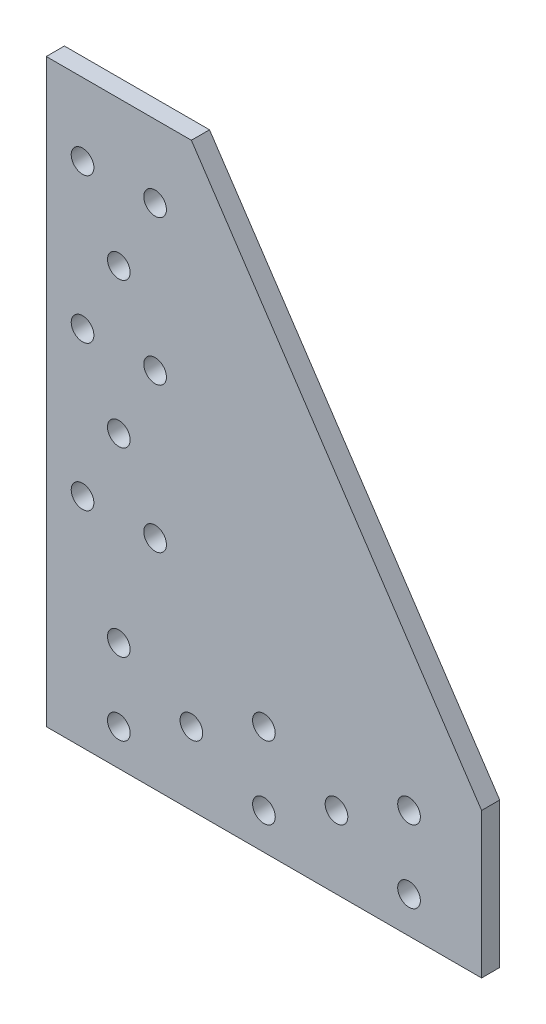
ISO-10303-21;
HEADER;
FILE_DESCRIPTION(('STEP AP214'),'2;1');
FILE_NAME('part.step','',(''),(''),'','','');
FILE_SCHEMA(('AUTOMOTIVE_DESIGN { 1 0 10303 214 1 1 1 1 }'));
ENDSEC;
DATA;
#1=APPLICATION_CONTEXT('core data for automotive mechanical design processes');
#2=APPLICATION_PROTOCOL_DEFINITION('international standard','automotive_design',2000,#1);
#3=PRODUCT_CONTEXT('',#1,'mechanical');
#4=PRODUCT('Part','Part','',(#3));
#5=PRODUCT_RELATED_PRODUCT_CATEGORY('part','',(#4));
#6=PRODUCT_DEFINITION_FORMATION('','',#4);
#7=PRODUCT_DEFINITION_CONTEXT('part definition',#1,'design');
#8=PRODUCT_DEFINITION('design','',#6,#7);
#9=PRODUCT_DEFINITION_SHAPE('','',#8);
#10=(LENGTH_UNIT() NAMED_UNIT(*) SI_UNIT(.MILLI.,.METRE.));
#11=(NAMED_UNIT(*) PLANE_ANGLE_UNIT() SI_UNIT($,.RADIAN.));
#12=(NAMED_UNIT(*) SI_UNIT($,.STERADIAN.) SOLID_ANGLE_UNIT());
#13=UNCERTAINTY_MEASURE_WITH_UNIT(LENGTH_MEASURE(1.E-05),#10,'distance_accuracy_value','');
#14=(GEOMETRIC_REPRESENTATION_CONTEXT(3) GLOBAL_UNCERTAINTY_ASSIGNED_CONTEXT((#13)) GLOBAL_UNIT_ASSIGNED_CONTEXT((#10,
#11,#12)) REPRESENTATION_CONTEXT('',''));
#15=CARTESIAN_POINT('',(0.,0.,0.));
#16=DIRECTION('',(0.,0.,1.));
#17=DIRECTION('',(1.,0.,0.));
#18=AXIS2_PLACEMENT_3D('',#15,#16,#17);
#19=CARTESIAN_POINT('',(-12.6999999999999,-584.2,3.175));
#20=DIRECTION('',(0.,1.,0.));
#21=DIRECTION('',(0.,0.,1.));
#22=AXIS2_PLACEMENT_3D('',#19,#20,#21);
#23=PLANE('',#22);
#24=DIRECTION('',(1.,0.,0.));
#25=VECTOR('',#24,1.);
#26=CARTESIAN_POINT('',(-12.6999999999999,-584.2,0.));
#27=LINE('',#26,#25);
#28=CARTESIAN_POINT('',(-12.6999999999999,-584.2,0.));
#29=VERTEX_POINT('',#28);
#30=CARTESIAN_POINT('',(63.5000000000001,-584.2,0.));
#31=VERTEX_POINT('',#30);
#32=EDGE_CURVE('E109',#29,#31,#27,.T.);
#33=ORIENTED_EDGE('',*,*,#32,.T.);
#34=DIRECTION('',(0.,0.,-1.));
#35=VECTOR('',#34,1.);
#36=CARTESIAN_POINT('',(63.5000000000001,-584.2,3.175));
#37=LINE('',#36,#35);
#38=CARTESIAN_POINT('',(63.5000000000001,-584.2,3.175));
#39=VERTEX_POINT('',#38);
#40=EDGE_CURVE('E11',#39,#31,#37,.T.);
#41=ORIENTED_EDGE('',*,*,#40,.F.);
#42=DIRECTION('',(1.,0.,0.));
#43=VECTOR('',#42,1.);
#44=CARTESIAN_POINT('',(-12.6999999999999,-584.2,3.175));
#45=LINE('',#44,#43);
#46=CARTESIAN_POINT('',(-12.6999999999999,-584.2,3.175));
#47=VERTEX_POINT('',#46);
#48=EDGE_CURVE('E118',#47,#39,#45,.T.);
#49=ORIENTED_EDGE('',*,*,#48,.F.);
#50=DIRECTION('',(0.,0.,-1.));
#51=VECTOR('',#50,1.);
#52=CARTESIAN_POINT('',(-12.6999999999999,-584.2,3.175));
#53=LINE('',#52,#51);
#54=EDGE_CURVE('E105',#47,#29,#53,.T.);
#55=ORIENTED_EDGE('',*,*,#54,.T.);
#56=EDGE_LOOP('',(#33,#41,#49,#55));
#57=FACE_BOUND('',#56,.T.);
#58=ADVANCED_FACE('F33',(#57),#23,.F.);
#59=CARTESIAN_POINT('',(63.5000000000001,-584.2,3.175));
#60=DIRECTION('',(-1.,0.,0.));
#61=DIRECTION('',(0.,0.,1.));
#62=AXIS2_PLACEMENT_3D('',#59,#60,#61);
#63=PLANE('',#62);
#64=DIRECTION('',(0.,1.,0.));
#65=VECTOR('',#64,1.);
#66=CARTESIAN_POINT('',(63.5000000000001,-584.2,0.));
#67=LINE('',#66,#65);
#68=CARTESIAN_POINT('',(63.5000000000001,-558.8,0.));
#69=VERTEX_POINT('',#68);
#70=EDGE_CURVE('E112',#31,#69,#67,.T.);
#71=ORIENTED_EDGE('',*,*,#70,.T.);
#72=DIRECTION('',(0.,0.,-1.));
#73=VECTOR('',#72,1.);
#74=CARTESIAN_POINT('',(63.5000000000001,-558.8,3.175));
#75=LINE('',#74,#73);
#76=CARTESIAN_POINT('',(63.5000000000001,-558.8,3.175));
#77=VERTEX_POINT('',#76);
#78=EDGE_CURVE('E42',#77,#69,#75,.T.);
#79=ORIENTED_EDGE('',*,*,#78,.F.);
#80=DIRECTION('',(0.,1.,0.));
#81=VECTOR('',#80,1.);
#82=CARTESIAN_POINT('',(63.5000000000001,-584.2,3.175));
#83=LINE('',#82,#81);
#84=EDGE_CURVE('E85',#39,#77,#83,.T.);
#85=ORIENTED_EDGE('',*,*,#84,.F.);
#86=ORIENTED_EDGE('',*,*,#40,.T.);
#87=EDGE_LOOP('',(#71,#79,#85,#86));
#88=FACE_BOUND('',#87,.T.);
#89=ADVANCED_FACE('F138',(#88),#63,.F.);
#90=CARTESIAN_POINT('',(63.5000000000001,-558.8,3.175));
#91=DIRECTION('',(-0.832050294337844,-0.554700196225229,0.));
#92=DIRECTION('',(0.554700196225229,-0.832050294337844,0.));
#93=AXIS2_PLACEMENT_3D('',#90,#91,#92);
#94=PLANE('',#93);
#95=DIRECTION('',(-0.554700196225229,0.832050294337844,0.));
#96=VECTOR('',#95,1.);
#97=CARTESIAN_POINT('',(63.5000000000001,-558.8,0.));
#98=LINE('',#97,#96);
#99=CARTESIAN_POINT('',(12.7000000000001,-482.6,0.));
#100=VERTEX_POINT('',#99);
#101=EDGE_CURVE('E100',#69,#100,#98,.T.);
#102=ORIENTED_EDGE('',*,*,#101,.T.);
#103=DIRECTION('',(0.,0.,-1.));
#104=VECTOR('',#103,1.);
#105=CARTESIAN_POINT('',(12.7000000000001,-482.6,3.175));
#106=LINE('',#105,#104);
#107=CARTESIAN_POINT('',(12.7000000000001,-482.6,3.175));
#108=VERTEX_POINT('',#107);
#109=EDGE_CURVE('E97',#108,#100,#106,.T.);
#110=ORIENTED_EDGE('',*,*,#109,.F.);
#111=DIRECTION('',(-0.554700196225229,0.832050294337844,0.));
#112=VECTOR('',#111,1.);
#113=CARTESIAN_POINT('',(63.5000000000001,-558.8,3.175));
#114=LINE('',#113,#112);
#115=EDGE_CURVE('E89',#77,#108,#114,.T.);
#116=ORIENTED_EDGE('',*,*,#115,.F.);
#117=ORIENTED_EDGE('',*,*,#78,.T.);
#118=EDGE_LOOP('',(#102,#110,#116,#117));
#119=FACE_BOUND('',#118,.T.);
#120=ADVANCED_FACE('F98',(#119),#94,.F.);
#121=CARTESIAN_POINT('',(-12.6999999999999,-482.6,3.175));
#122=DIRECTION('',(0.,-1.,0.));
#123=DIRECTION('',(0.,0.,-1.));
#124=AXIS2_PLACEMENT_3D('',#121,#122,#123);
#125=PLANE('',#124);
#126=DIRECTION('',(-1.,0.,0.));
#127=VECTOR('',#126,1.);
#128=CARTESIAN_POINT('',(-12.6999999999999,-482.6,0.));
#129=LINE('',#128,#127);
#130=CARTESIAN_POINT('',(-12.6999999999999,-482.6,0.));
#131=VERTEX_POINT('',#130);
#132=EDGE_CURVE('E71',#100,#131,#129,.T.);
#133=ORIENTED_EDGE('',*,*,#132,.T.);
#134=DIRECTION('',(0.,0.,-1.));
#135=VECTOR('',#134,1.);
#136=CARTESIAN_POINT('',(-12.6999999999999,-482.6,3.175));
#137=LINE('',#136,#135);
#138=CARTESIAN_POINT('',(-12.6999999999999,-482.6,3.175));
#139=VERTEX_POINT('',#138);
#140=EDGE_CURVE('E101',#139,#131,#137,.T.);
#141=ORIENTED_EDGE('',*,*,#140,.F.);
#142=DIRECTION('',(-1.,0.,0.));
#143=VECTOR('',#142,1.);
#144=CARTESIAN_POINT('',(-12.6999999999999,-482.6,3.175));
#145=LINE('',#144,#143);
#146=EDGE_CURVE('E93',#108,#139,#145,.T.);
#147=ORIENTED_EDGE('',*,*,#146,.F.);
#148=ORIENTED_EDGE('',*,*,#109,.T.);
#149=EDGE_LOOP('',(#133,#141,#147,#148));
#150=FACE_BOUND('',#149,.T.);
#151=ADVANCED_FACE('F103',(#150),#125,.F.);
#152=CARTESIAN_POINT('',(-12.6999999999999,-584.2,3.175));
#153=DIRECTION('',(1.,0.,0.));
#154=DIRECTION('',(0.,1.,0.));
#155=AXIS2_PLACEMENT_3D('',#152,#153,#154);
#156=PLANE('',#155);
#157=DIRECTION('',(0.,-1.,0.));
#158=VECTOR('',#157,1.);
#159=CARTESIAN_POINT('',(-12.6999999999999,-584.2,0.));
#160=LINE('',#159,#158);
#161=EDGE_CURVE('E77',#131,#29,#160,.T.);
#162=ORIENTED_EDGE('',*,*,#161,.T.);
#163=ORIENTED_EDGE('',*,*,#54,.F.);
#164=DIRECTION('',(0.,-1.,0.));
#165=VECTOR('',#164,1.);
#166=CARTESIAN_POINT('',(-12.6999999999999,-584.2,3.175));
#167=LINE('',#166,#165);
#168=EDGE_CURVE('E51',#139,#47,#167,.T.);
#169=ORIENTED_EDGE('',*,*,#168,.F.);
#170=ORIENTED_EDGE('',*,*,#140,.T.);
#171=EDGE_LOOP('',(#162,#163,#169,#170));
#172=FACE_BOUND('',#171,.T.);
#173=ADVANCED_FACE('F152',(#172),#156,.F.);
#174=CARTESIAN_POINT('',(0.,0.,3.175));
#175=DIRECTION('',(0.,0.,1.));
#176=DIRECTION('',(1.,0.,0.));
#177=AXIS2_PLACEMENT_3D('',#174,#175,#176);
#178=PLANE('',#177);
#179=CARTESIAN_POINT('',(-6.34999999999991,-495.3,3.175));
#180=DIRECTION('',(0.,0.,1.));
#181=DIRECTION('',(1.,0.,0.));
#182=AXIS2_PLACEMENT_3D('',#179,#180,#181);
#183=CIRCLE('',#182,1.984375);
#184=CARTESIAN_POINT('',(-4.36562499999991,-495.3,3.175));
#185=VERTEX_POINT('',#184);
#186=EDGE_CURVE('E342',#185,#185,#183,.T.);
#187=ORIENTED_EDGE('',*,*,#186,.F.);
#188=EDGE_LOOP('',(#187));
#189=FACE_BOUND('',#188,.T.);
#190=CARTESIAN_POINT('',(6.3500000000001,-495.3,3.175));
#191=DIRECTION('',(0.,0.,1.));
#192=DIRECTION('',(1.,0.,0.));
#193=AXIS2_PLACEMENT_3D('',#190,#191,#192);
#194=CIRCLE('',#193,1.984375);
#195=CARTESIAN_POINT('',(8.3343750000001,-495.3,3.175));
#196=VERTEX_POINT('',#195);
#197=EDGE_CURVE('E345',#196,#196,#194,.T.);
#198=ORIENTED_EDGE('',*,*,#197,.F.);
#199=EDGE_LOOP('',(#198));
#200=FACE_BOUND('',#199,.T.);
#201=CARTESIAN_POINT('',(0.,-508.,3.175));
#202=DIRECTION('',(0.,0.,1.));
#203=DIRECTION('',(1.,0.,0.));
#204=AXIS2_PLACEMENT_3D('',#201,#202,#203);
#205=CIRCLE('',#204,1.984375);
#206=CARTESIAN_POINT('',(1.98437500000003,-508.,3.175));
#207=VERTEX_POINT('',#206);
#208=EDGE_CURVE('E354',#207,#207,#205,.T.);
#209=ORIENTED_EDGE('',*,*,#208,.F.);
#210=EDGE_LOOP('',(#209));
#211=FACE_BOUND('',#210,.T.);
#212=CARTESIAN_POINT('',(-6.34999999999991,-520.7,3.175));
#213=DIRECTION('',(0.,0.,1.));
#214=DIRECTION('',(1.,0.,0.));
#215=AXIS2_PLACEMENT_3D('',#212,#213,#214);
#216=CIRCLE('',#215,1.984375);
#217=CARTESIAN_POINT('',(-4.36562499999991,-520.7,3.175));
#218=VERTEX_POINT('',#217);
#219=EDGE_CURVE('E360',#218,#218,#216,.T.);
#220=ORIENTED_EDGE('',*,*,#219,.F.);
#221=EDGE_LOOP('',(#220));
#222=FACE_BOUND('',#221,.T.);
#223=CARTESIAN_POINT('',(6.3500000000001,-520.7,3.175));
#224=DIRECTION('',(0.,0.,1.));
#225=DIRECTION('',(1.,0.,0.));
#226=AXIS2_PLACEMENT_3D('',#223,#224,#225);
#227=CIRCLE('',#226,1.984375);
#228=CARTESIAN_POINT('',(8.3343750000001,-520.7,3.175));
#229=VERTEX_POINT('',#228);
#230=EDGE_CURVE('E366',#229,#229,#227,.T.);
#231=ORIENTED_EDGE('',*,*,#230,.F.);
#232=EDGE_LOOP('',(#231));
#233=FACE_BOUND('',#232,.T.);
#234=CARTESIAN_POINT('',(0.,-533.4,3.175));
#235=DIRECTION('',(0.,0.,1.));
#236=DIRECTION('',(1.,0.,0.));
#237=AXIS2_PLACEMENT_3D('',#234,#235,#236);
#238=CIRCLE('',#237,1.984375);
#239=CARTESIAN_POINT('',(1.98437500000003,-533.4,3.175));
#240=VERTEX_POINT('',#239);
#241=EDGE_CURVE('E372',#240,#240,#238,.T.);
#242=ORIENTED_EDGE('',*,*,#241,.F.);
#243=EDGE_LOOP('',(#242));
#244=FACE_BOUND('',#243,.T.);
#245=CARTESIAN_POINT('',(-6.34999999999991,-546.1,3.175));
#246=DIRECTION('',(0.,0.,1.));
#247=DIRECTION('',(1.,0.,0.));
#248=AXIS2_PLACEMENT_3D('',#245,#246,#247);
#249=CIRCLE('',#248,1.984375);
#250=CARTESIAN_POINT('',(-4.36562499999991,-546.1,3.175));
#251=VERTEX_POINT('',#250);
#252=EDGE_CURVE('E378',#251,#251,#249,.T.);
#253=ORIENTED_EDGE('',*,*,#252,.F.);
#254=EDGE_LOOP('',(#253));
#255=FACE_BOUND('',#254,.T.);
#256=CARTESIAN_POINT('',(6.3500000000001,-546.1,3.175));
#257=DIRECTION('',(0.,0.,1.));
#258=DIRECTION('',(1.,0.,0.));
#259=AXIS2_PLACEMENT_3D('',#256,#257,#258);
#260=CIRCLE('',#259,1.984375);
#261=CARTESIAN_POINT('',(8.3343750000001,-546.1,3.175));
#262=VERTEX_POINT('',#261);
#263=EDGE_CURVE('E384',#262,#262,#260,.T.);
#264=ORIENTED_EDGE('',*,*,#263,.F.);
#265=EDGE_LOOP('',(#264));
#266=FACE_BOUND('',#265,.T.);
#267=CARTESIAN_POINT('',(0.,-577.85,3.175));
#268=DIRECTION('',(0.,0.,1.));
#269=DIRECTION('',(1.,0.,0.));
#270=AXIS2_PLACEMENT_3D('',#267,#268,#269);
#271=CIRCLE('',#270,1.984375);
#272=CARTESIAN_POINT('',(1.98437500000009,-577.85,3.175));
#273=VERTEX_POINT('',#272);
#274=EDGE_CURVE('E390',#273,#273,#271,.T.);
#275=ORIENTED_EDGE('',*,*,#274,.F.);
#276=EDGE_LOOP('',(#275));
#277=FACE_BOUND('',#276,.T.);
#278=CARTESIAN_POINT('',(0.,-565.15,3.175));
#279=DIRECTION('',(0.,0.,1.));
#280=DIRECTION('',(1.,0.,0.));
#281=AXIS2_PLACEMENT_3D('',#278,#279,#280);
#282=CIRCLE('',#281,1.984375);
#283=CARTESIAN_POINT('',(1.98437500000009,-565.15,3.175));
#284=VERTEX_POINT('',#283);
#285=EDGE_CURVE('E396',#284,#284,#282,.T.);
#286=ORIENTED_EDGE('',*,*,#285,.F.);
#287=EDGE_LOOP('',(#286));
#288=FACE_BOUND('',#287,.T.);
#289=CARTESIAN_POINT('',(12.7000000000001,-571.5,3.175));
#290=DIRECTION('',(0.,0.,1.));
#291=DIRECTION('',(1.,0.,0.));
#292=AXIS2_PLACEMENT_3D('',#289,#290,#291);
#293=CIRCLE('',#292,1.984375);
#294=CARTESIAN_POINT('',(14.6843750000001,-571.5,3.175));
#295=VERTEX_POINT('',#294);
#296=EDGE_CURVE('E402',#295,#295,#293,.T.);
#297=ORIENTED_EDGE('',*,*,#296,.F.);
#298=EDGE_LOOP('',(#297));
#299=FACE_BOUND('',#298,.T.);
#300=CARTESIAN_POINT('',(25.4000000000001,-565.15,3.175));
#301=DIRECTION('',(0.,0.,1.));
#302=DIRECTION('',(1.,0.,0.));
#303=AXIS2_PLACEMENT_3D('',#300,#301,#302);
#304=CIRCLE('',#303,1.984375);
#305=CARTESIAN_POINT('',(27.3843750000001,-565.15,3.175));
#306=VERTEX_POINT('',#305);
#307=EDGE_CURVE('E408',#306,#306,#304,.T.);
#308=ORIENTED_EDGE('',*,*,#307,.F.);
#309=EDGE_LOOP('',(#308));
#310=FACE_BOUND('',#309,.T.);
#311=CARTESIAN_POINT('',(25.4000000000001,-577.85,3.175));
#312=DIRECTION('',(0.,0.,1.));
#313=DIRECTION('',(1.,0.,0.));
#314=AXIS2_PLACEMENT_3D('',#311,#312,#313);
#315=CIRCLE('',#314,1.984375);
#316=CARTESIAN_POINT('',(27.3843750000001,-577.85,3.175));
#317=VERTEX_POINT('',#316);
#318=EDGE_CURVE('E414',#317,#317,#315,.T.);
#319=ORIENTED_EDGE('',*,*,#318,.F.);
#320=EDGE_LOOP('',(#319));
#321=FACE_BOUND('',#320,.T.);
#322=CARTESIAN_POINT('',(38.1000000000001,-571.5,3.175));
#323=DIRECTION('',(0.,0.,1.));
#324=DIRECTION('',(1.,0.,0.));
#325=AXIS2_PLACEMENT_3D('',#322,#323,#324);
#326=CIRCLE('',#325,1.984375);
#327=CARTESIAN_POINT('',(40.0843750000001,-571.5,3.175));
#328=VERTEX_POINT('',#327);
#329=EDGE_CURVE('E420',#328,#328,#326,.T.);
#330=ORIENTED_EDGE('',*,*,#329,.F.);
#331=EDGE_LOOP('',(#330));
#332=FACE_BOUND('',#331,.T.);
#333=CARTESIAN_POINT('',(50.8000000000001,-565.15,3.175));
#334=DIRECTION('',(0.,0.,1.));
#335=DIRECTION('',(1.,0.,0.));
#336=AXIS2_PLACEMENT_3D('',#333,#334,#335);
#337=CIRCLE('',#336,1.984375);
#338=CARTESIAN_POINT('',(52.7843750000001,-565.15,3.175));
#339=VERTEX_POINT('',#338);
#340=EDGE_CURVE('E130',#339,#339,#337,.T.);
#341=ORIENTED_EDGE('',*,*,#340,.F.);
#342=EDGE_LOOP('',(#341));
#343=FACE_BOUND('',#342,.T.);
#344=CARTESIAN_POINT('',(50.8000000000001,-577.85,3.175));
#345=DIRECTION('',(0.,0.,1.));
#346=DIRECTION('',(1.,0.,0.));
#347=AXIS2_PLACEMENT_3D('',#344,#345,#346);
#348=CIRCLE('',#347,1.984375);
#349=CARTESIAN_POINT('',(52.7843750000001,-577.85,3.175));
#350=VERTEX_POINT('',#349);
#351=EDGE_CURVE('E122',#350,#350,#348,.T.);
#352=ORIENTED_EDGE('',*,*,#351,.F.);
#353=EDGE_LOOP('',(#352));
#354=FACE_BOUND('',#353,.T.);
#355=ORIENTED_EDGE('',*,*,#48,.T.);
#356=ORIENTED_EDGE('',*,*,#84,.T.);
#357=ORIENTED_EDGE('',*,*,#115,.T.);
#358=ORIENTED_EDGE('',*,*,#146,.T.);
#359=ORIENTED_EDGE('',*,*,#168,.T.);
#360=EDGE_LOOP('',(#355,#356,#357,#358,#359));
#361=FACE_BOUND('',#360,.T.);
#362=ADVANCED_FACE('F91',(#189,#200,#211,#222,#233,#244,#255,#266,#277,#288,#299,#310,#321,#332,
#343,#354,#361),#178,.T.);
#363=CARTESIAN_POINT('',(0.,0.,0.));
#364=DIRECTION('',(0.,0.,1.));
#365=DIRECTION('',(1.,0.,0.));
#366=AXIS2_PLACEMENT_3D('',#363,#364,#365);
#367=PLANE('',#366);
#368=CARTESIAN_POINT('',(-6.34999999999991,-495.3,0.));
#369=DIRECTION('',(0.,0.,1.));
#370=DIRECTION('',(1.,0.,0.));
#371=AXIS2_PLACEMENT_3D('',#368,#369,#370);
#372=CIRCLE('',#371,1.984375);
#373=CARTESIAN_POINT('',(-4.36562499999991,-495.3,0.));
#374=VERTEX_POINT('',#373);
#375=EDGE_CURVE('E344',#374,#374,#372,.T.);
#376=ORIENTED_EDGE('',*,*,#375,.T.);
#377=EDGE_LOOP('',(#376));
#378=FACE_BOUND('',#377,.T.);
#379=CARTESIAN_POINT('',(6.3500000000001,-495.3,0.));
#380=DIRECTION('',(0.,0.,1.));
#381=DIRECTION('',(1.,0.,0.));
#382=AXIS2_PLACEMENT_3D('',#379,#380,#381);
#383=CIRCLE('',#382,1.984375);
#384=CARTESIAN_POINT('',(8.3343750000001,-495.3,0.));
#385=VERTEX_POINT('',#384);
#386=EDGE_CURVE('E348',#385,#385,#383,.T.);
#387=ORIENTED_EDGE('',*,*,#386,.T.);
#388=EDGE_LOOP('',(#387));
#389=FACE_BOUND('',#388,.T.);
#390=CARTESIAN_POINT('',(0.,-508.,0.));
#391=DIRECTION('',(0.,0.,1.));
#392=DIRECTION('',(1.,0.,0.));
#393=AXIS2_PLACEMENT_3D('',#390,#391,#392);
#394=CIRCLE('',#393,1.984375);
#395=CARTESIAN_POINT('',(1.98437500000003,-508.,0.));
#396=VERTEX_POINT('',#395);
#397=EDGE_CURVE('E357',#396,#396,#394,.T.);
#398=ORIENTED_EDGE('',*,*,#397,.T.);
#399=EDGE_LOOP('',(#398));
#400=FACE_BOUND('',#399,.T.);
#401=CARTESIAN_POINT('',(-6.34999999999991,-520.7,0.));
#402=DIRECTION('',(0.,0.,1.));
#403=DIRECTION('',(1.,0.,0.));
#404=AXIS2_PLACEMENT_3D('',#401,#402,#403);
#405=CIRCLE('',#404,1.984375);
#406=CARTESIAN_POINT('',(-4.36562499999991,-520.7,0.));
#407=VERTEX_POINT('',#406);
#408=EDGE_CURVE('E363',#407,#407,#405,.T.);
#409=ORIENTED_EDGE('',*,*,#408,.T.);
#410=EDGE_LOOP('',(#409));
#411=FACE_BOUND('',#410,.T.);
#412=CARTESIAN_POINT('',(6.3500000000001,-520.7,0.));
#413=DIRECTION('',(0.,0.,1.));
#414=DIRECTION('',(1.,0.,0.));
#415=AXIS2_PLACEMENT_3D('',#412,#413,#414);
#416=CIRCLE('',#415,1.984375);
#417=CARTESIAN_POINT('',(8.3343750000001,-520.7,0.));
#418=VERTEX_POINT('',#417);
#419=EDGE_CURVE('E369',#418,#418,#416,.T.);
#420=ORIENTED_EDGE('',*,*,#419,.T.);
#421=EDGE_LOOP('',(#420));
#422=FACE_BOUND('',#421,.T.);
#423=CARTESIAN_POINT('',(0.,-533.4,0.));
#424=DIRECTION('',(0.,0.,1.));
#425=DIRECTION('',(1.,0.,0.));
#426=AXIS2_PLACEMENT_3D('',#423,#424,#425);
#427=CIRCLE('',#426,1.984375);
#428=CARTESIAN_POINT('',(1.98437500000003,-533.4,0.));
#429=VERTEX_POINT('',#428);
#430=EDGE_CURVE('E375',#429,#429,#427,.T.);
#431=ORIENTED_EDGE('',*,*,#430,.T.);
#432=EDGE_LOOP('',(#431));
#433=FACE_BOUND('',#432,.T.);
#434=CARTESIAN_POINT('',(-6.34999999999991,-546.1,0.));
#435=DIRECTION('',(0.,0.,1.));
#436=DIRECTION('',(1.,0.,0.));
#437=AXIS2_PLACEMENT_3D('',#434,#435,#436);
#438=CIRCLE('',#437,1.984375);
#439=CARTESIAN_POINT('',(-4.36562499999991,-546.1,0.));
#440=VERTEX_POINT('',#439);
#441=EDGE_CURVE('E381',#440,#440,#438,.T.);
#442=ORIENTED_EDGE('',*,*,#441,.T.);
#443=EDGE_LOOP('',(#442));
#444=FACE_BOUND('',#443,.T.);
#445=CARTESIAN_POINT('',(6.3500000000001,-546.1,0.));
#446=DIRECTION('',(0.,0.,1.));
#447=DIRECTION('',(1.,0.,0.));
#448=AXIS2_PLACEMENT_3D('',#445,#446,#447);
#449=CIRCLE('',#448,1.984375);
#450=CARTESIAN_POINT('',(8.3343750000001,-546.1,0.));
#451=VERTEX_POINT('',#450);
#452=EDGE_CURVE('E387',#451,#451,#449,.T.);
#453=ORIENTED_EDGE('',*,*,#452,.T.);
#454=EDGE_LOOP('',(#453));
#455=FACE_BOUND('',#454,.T.);
#456=CARTESIAN_POINT('',(0.,-577.85,0.));
#457=DIRECTION('',(0.,0.,1.));
#458=DIRECTION('',(1.,0.,0.));
#459=AXIS2_PLACEMENT_3D('',#456,#457,#458);
#460=CIRCLE('',#459,1.984375);
#461=CARTESIAN_POINT('',(1.98437500000009,-577.85,0.));
#462=VERTEX_POINT('',#461);
#463=EDGE_CURVE('E393',#462,#462,#460,.T.);
#464=ORIENTED_EDGE('',*,*,#463,.T.);
#465=EDGE_LOOP('',(#464));
#466=FACE_BOUND('',#465,.T.);
#467=CARTESIAN_POINT('',(0.,-565.15,0.));
#468=DIRECTION('',(0.,0.,1.));
#469=DIRECTION('',(1.,0.,0.));
#470=AXIS2_PLACEMENT_3D('',#467,#468,#469);
#471=CIRCLE('',#470,1.984375);
#472=CARTESIAN_POINT('',(1.98437500000009,-565.15,0.));
#473=VERTEX_POINT('',#472);
#474=EDGE_CURVE('E399',#473,#473,#471,.T.);
#475=ORIENTED_EDGE('',*,*,#474,.T.);
#476=EDGE_LOOP('',(#475));
#477=FACE_BOUND('',#476,.T.);
#478=CARTESIAN_POINT('',(12.7000000000001,-571.5,0.));
#479=DIRECTION('',(0.,0.,1.));
#480=DIRECTION('',(1.,0.,0.));
#481=AXIS2_PLACEMENT_3D('',#478,#479,#480);
#482=CIRCLE('',#481,1.984375);
#483=CARTESIAN_POINT('',(14.6843750000001,-571.5,0.));
#484=VERTEX_POINT('',#483);
#485=EDGE_CURVE('E405',#484,#484,#482,.T.);
#486=ORIENTED_EDGE('',*,*,#485,.T.);
#487=EDGE_LOOP('',(#486));
#488=FACE_BOUND('',#487,.T.);
#489=CARTESIAN_POINT('',(25.4000000000001,-565.15,0.));
#490=DIRECTION('',(0.,0.,1.));
#491=DIRECTION('',(1.,0.,0.));
#492=AXIS2_PLACEMENT_3D('',#489,#490,#491);
#493=CIRCLE('',#492,1.984375);
#494=CARTESIAN_POINT('',(27.3843750000001,-565.15,0.));
#495=VERTEX_POINT('',#494);
#496=EDGE_CURVE('E411',#495,#495,#493,.T.);
#497=ORIENTED_EDGE('',*,*,#496,.T.);
#498=EDGE_LOOP('',(#497));
#499=FACE_BOUND('',#498,.T.);
#500=CARTESIAN_POINT('',(25.4000000000001,-577.85,0.));
#501=DIRECTION('',(0.,0.,1.));
#502=DIRECTION('',(1.,0.,0.));
#503=AXIS2_PLACEMENT_3D('',#500,#501,#502);
#504=CIRCLE('',#503,1.984375);
#505=CARTESIAN_POINT('',(27.3843750000001,-577.85,0.));
#506=VERTEX_POINT('',#505);
#507=EDGE_CURVE('E417',#506,#506,#504,.T.);
#508=ORIENTED_EDGE('',*,*,#507,.T.);
#509=EDGE_LOOP('',(#508));
#510=FACE_BOUND('',#509,.T.);
#511=CARTESIAN_POINT('',(38.1000000000001,-571.5,0.));
#512=DIRECTION('',(0.,0.,1.));
#513=DIRECTION('',(1.,0.,0.));
#514=AXIS2_PLACEMENT_3D('',#511,#512,#513);
#515=CIRCLE('',#514,1.984375);
#516=CARTESIAN_POINT('',(40.0843750000001,-571.5,0.));
#517=VERTEX_POINT('',#516);
#518=EDGE_CURVE('E422',#517,#517,#515,.T.);
#519=ORIENTED_EDGE('',*,*,#518,.T.);
#520=EDGE_LOOP('',(#519));
#521=FACE_BOUND('',#520,.T.);
#522=CARTESIAN_POINT('',(50.8000000000001,-565.15,0.));
#523=DIRECTION('',(0.,0.,1.));
#524=DIRECTION('',(1.,0.,0.));
#525=AXIS2_PLACEMENT_3D('',#522,#523,#524);
#526=CIRCLE('',#525,1.984375);
#527=CARTESIAN_POINT('',(52.7843750000001,-565.15,0.));
#528=VERTEX_POINT('',#527);
#529=EDGE_CURVE('E36',#528,#528,#526,.T.);
#530=ORIENTED_EDGE('',*,*,#529,.T.);
#531=EDGE_LOOP('',(#530));
#532=FACE_BOUND('',#531,.T.);
#533=CARTESIAN_POINT('',(50.8000000000001,-577.85,0.));
#534=DIRECTION('',(0.,0.,1.));
#535=DIRECTION('',(1.,0.,0.));
#536=AXIS2_PLACEMENT_3D('',#533,#534,#535);
#537=CIRCLE('',#536,1.984375);
#538=CARTESIAN_POINT('',(52.7843750000001,-577.85,0.));
#539=VERTEX_POINT('',#538);
#540=EDGE_CURVE('E113',#539,#539,#537,.T.);
#541=ORIENTED_EDGE('',*,*,#540,.T.);
#542=EDGE_LOOP('',(#541));
#543=FACE_BOUND('',#542,.T.);
#544=ORIENTED_EDGE('',*,*,#32,.F.);
#545=ORIENTED_EDGE('',*,*,#161,.F.);
#546=ORIENTED_EDGE('',*,*,#132,.F.);
#547=ORIENTED_EDGE('',*,*,#101,.F.);
#548=ORIENTED_EDGE('',*,*,#70,.F.);
#549=EDGE_LOOP('',(#544,#545,#546,#547,#548));
#550=FACE_BOUND('',#549,.T.);
#551=ADVANCED_FACE('F140',(#378,#389,#400,#411,#422,#433,#444,#455,#466,#477,#488,#499,#510,
#521,#532,#543,#550),#367,.F.);
#552=CARTESIAN_POINT('',(50.8000000000001,-577.85,3.175));
#553=DIRECTION('',(0.,0.,1.));
#554=DIRECTION('',(1.,0.,0.));
#555=AXIS2_PLACEMENT_3D('',#552,#553,#554);
#556=CYLINDRICAL_SURFACE('',#555,1.984375);
#557=ORIENTED_EDGE('',*,*,#351,.T.);
#558=EDGE_LOOP('',(#557));
#559=FACE_BOUND('',#558,.T.);
#560=ORIENTED_EDGE('',*,*,#540,.F.);
#561=EDGE_LOOP('',(#560));
#562=FACE_BOUND('',#561,.T.);
#563=ADVANCED_FACE('F142',(#559,#562),#556,.F.);
#564=CARTESIAN_POINT('',(50.8000000000001,-565.15,3.175));
#565=DIRECTION('',(0.,0.,1.));
#566=DIRECTION('',(1.,0.,0.));
#567=AXIS2_PLACEMENT_3D('',#564,#565,#566);
#568=CYLINDRICAL_SURFACE('',#567,1.984375);
#569=ORIENTED_EDGE('',*,*,#340,.T.);
#570=EDGE_LOOP('',(#569));
#571=FACE_BOUND('',#570,.T.);
#572=ORIENTED_EDGE('',*,*,#529,.F.);
#573=EDGE_LOOP('',(#572));
#574=FACE_BOUND('',#573,.T.);
#575=ADVANCED_FACE('F150',(#571,#574),#568,.F.);
#576=CARTESIAN_POINT('',(38.1000000000001,-571.5,3.175));
#577=DIRECTION('',(0.,0.,1.));
#578=DIRECTION('',(1.,0.,0.));
#579=AXIS2_PLACEMENT_3D('',#576,#577,#578);
#580=CYLINDRICAL_SURFACE('',#579,1.984375);
#581=ORIENTED_EDGE('',*,*,#329,.T.);
#582=EDGE_LOOP('',(#581));
#583=FACE_BOUND('',#582,.T.);
#584=ORIENTED_EDGE('',*,*,#518,.F.);
#585=EDGE_LOOP('',(#584));
#586=FACE_BOUND('',#585,.T.);
#587=ADVANCED_FACE('F192',(#583,#586),#580,.F.);
#588=CARTESIAN_POINT('',(25.4000000000001,-577.85,3.175));
#589=DIRECTION('',(0.,0.,1.));
#590=DIRECTION('',(1.,0.,0.));
#591=AXIS2_PLACEMENT_3D('',#588,#589,#590);
#592=CYLINDRICAL_SURFACE('',#591,1.984375);
#593=ORIENTED_EDGE('',*,*,#318,.T.);
#594=EDGE_LOOP('',(#593));
#595=FACE_BOUND('',#594,.T.);
#596=ORIENTED_EDGE('',*,*,#507,.F.);
#597=EDGE_LOOP('',(#596));
#598=FACE_BOUND('',#597,.T.);
#599=ADVANCED_FACE('F200',(#595,#598),#592,.F.);
#600=CARTESIAN_POINT('',(25.4000000000001,-565.15,3.175));
#601=DIRECTION('',(0.,0.,1.));
#602=DIRECTION('',(1.,0.,0.));
#603=AXIS2_PLACEMENT_3D('',#600,#601,#602);
#604=CYLINDRICAL_SURFACE('',#603,1.984375);
#605=ORIENTED_EDGE('',*,*,#307,.T.);
#606=EDGE_LOOP('',(#605));
#607=FACE_BOUND('',#606,.T.);
#608=ORIENTED_EDGE('',*,*,#496,.F.);
#609=EDGE_LOOP('',(#608));
#610=FACE_BOUND('',#609,.T.);
#611=ADVANCED_FACE('F208',(#607,#610),#604,.F.);
#612=CARTESIAN_POINT('',(12.7000000000001,-571.5,3.175));
#613=DIRECTION('',(0.,0.,1.));
#614=DIRECTION('',(1.,0.,0.));
#615=AXIS2_PLACEMENT_3D('',#612,#613,#614);
#616=CYLINDRICAL_SURFACE('',#615,1.984375);
#617=ORIENTED_EDGE('',*,*,#296,.T.);
#618=EDGE_LOOP('',(#617));
#619=FACE_BOUND('',#618,.T.);
#620=ORIENTED_EDGE('',*,*,#485,.F.);
#621=EDGE_LOOP('',(#620));
#622=FACE_BOUND('',#621,.T.);
#623=ADVANCED_FACE('F216',(#619,#622),#616,.F.);
#624=CARTESIAN_POINT('',(0.,-565.15,3.175));
#625=DIRECTION('',(0.,0.,1.));
#626=DIRECTION('',(1.,0.,0.));
#627=AXIS2_PLACEMENT_3D('',#624,#625,#626);
#628=CYLINDRICAL_SURFACE('',#627,1.984375);
#629=ORIENTED_EDGE('',*,*,#285,.T.);
#630=EDGE_LOOP('',(#629));
#631=FACE_BOUND('',#630,.T.);
#632=ORIENTED_EDGE('',*,*,#474,.F.);
#633=EDGE_LOOP('',(#632));
#634=FACE_BOUND('',#633,.T.);
#635=ADVANCED_FACE('F224',(#631,#634),#628,.F.);
#636=CARTESIAN_POINT('',(0.,-577.85,3.175));
#637=DIRECTION('',(0.,0.,1.));
#638=DIRECTION('',(1.,0.,0.));
#639=AXIS2_PLACEMENT_3D('',#636,#637,#638);
#640=CYLINDRICAL_SURFACE('',#639,1.984375);
#641=ORIENTED_EDGE('',*,*,#274,.T.);
#642=EDGE_LOOP('',(#641));
#643=FACE_BOUND('',#642,.T.);
#644=ORIENTED_EDGE('',*,*,#463,.F.);
#645=EDGE_LOOP('',(#644));
#646=FACE_BOUND('',#645,.T.);
#647=ADVANCED_FACE('F232',(#643,#646),#640,.F.);
#648=CARTESIAN_POINT('',(6.3500000000001,-546.1,3.175));
#649=DIRECTION('',(0.,0.,1.));
#650=DIRECTION('',(1.,0.,0.));
#651=AXIS2_PLACEMENT_3D('',#648,#649,#650);
#652=CYLINDRICAL_SURFACE('',#651,1.984375);
#653=ORIENTED_EDGE('',*,*,#263,.T.);
#654=EDGE_LOOP('',(#653));
#655=FACE_BOUND('',#654,.T.);
#656=ORIENTED_EDGE('',*,*,#452,.F.);
#657=EDGE_LOOP('',(#656));
#658=FACE_BOUND('',#657,.T.);
#659=ADVANCED_FACE('F240',(#655,#658),#652,.F.);
#660=CARTESIAN_POINT('',(-6.34999999999991,-546.1,3.175));
#661=DIRECTION('',(0.,0.,1.));
#662=DIRECTION('',(1.,0.,0.));
#663=AXIS2_PLACEMENT_3D('',#660,#661,#662);
#664=CYLINDRICAL_SURFACE('',#663,1.984375);
#665=ORIENTED_EDGE('',*,*,#252,.T.);
#666=EDGE_LOOP('',(#665));
#667=FACE_BOUND('',#666,.T.);
#668=ORIENTED_EDGE('',*,*,#441,.F.);
#669=EDGE_LOOP('',(#668));
#670=FACE_BOUND('',#669,.T.);
#671=ADVANCED_FACE('F248',(#667,#670),#664,.F.);
#672=CARTESIAN_POINT('',(0.,-533.4,3.175));
#673=DIRECTION('',(0.,0.,1.));
#674=DIRECTION('',(1.,0.,0.));
#675=AXIS2_PLACEMENT_3D('',#672,#673,#674);
#676=CYLINDRICAL_SURFACE('',#675,1.984375);
#677=ORIENTED_EDGE('',*,*,#241,.T.);
#678=EDGE_LOOP('',(#677));
#679=FACE_BOUND('',#678,.T.);
#680=ORIENTED_EDGE('',*,*,#430,.F.);
#681=EDGE_LOOP('',(#680));
#682=FACE_BOUND('',#681,.T.);
#683=ADVANCED_FACE('F256',(#679,#682),#676,.F.);
#684=CARTESIAN_POINT('',(6.3500000000001,-520.7,3.175));
#685=DIRECTION('',(0.,0.,1.));
#686=DIRECTION('',(1.,0.,0.));
#687=AXIS2_PLACEMENT_3D('',#684,#685,#686);
#688=CYLINDRICAL_SURFACE('',#687,1.984375);
#689=ORIENTED_EDGE('',*,*,#230,.T.);
#690=EDGE_LOOP('',(#689));
#691=FACE_BOUND('',#690,.T.);
#692=ORIENTED_EDGE('',*,*,#419,.F.);
#693=EDGE_LOOP('',(#692));
#694=FACE_BOUND('',#693,.T.);
#695=ADVANCED_FACE('F264',(#691,#694),#688,.F.);
#696=CARTESIAN_POINT('',(-6.34999999999991,-520.7,3.175));
#697=DIRECTION('',(0.,0.,1.));
#698=DIRECTION('',(1.,0.,0.));
#699=AXIS2_PLACEMENT_3D('',#696,#697,#698);
#700=CYLINDRICAL_SURFACE('',#699,1.984375);
#701=ORIENTED_EDGE('',*,*,#219,.T.);
#702=EDGE_LOOP('',(#701));
#703=FACE_BOUND('',#702,.T.);
#704=ORIENTED_EDGE('',*,*,#408,.F.);
#705=EDGE_LOOP('',(#704));
#706=FACE_BOUND('',#705,.T.);
#707=ADVANCED_FACE('F272',(#703,#706),#700,.F.);
#708=CARTESIAN_POINT('',(0.,-508.,3.175));
#709=DIRECTION('',(0.,0.,1.));
#710=DIRECTION('',(1.,0.,0.));
#711=AXIS2_PLACEMENT_3D('',#708,#709,#710);
#712=CYLINDRICAL_SURFACE('',#711,1.984375);
#713=ORIENTED_EDGE('',*,*,#208,.T.);
#714=EDGE_LOOP('',(#713));
#715=FACE_BOUND('',#714,.T.);
#716=ORIENTED_EDGE('',*,*,#397,.F.);
#717=EDGE_LOOP('',(#716));
#718=FACE_BOUND('',#717,.T.);
#719=ADVANCED_FACE('F280',(#715,#718),#712,.F.);
#720=CARTESIAN_POINT('',(6.3500000000001,-495.3,3.175));
#721=DIRECTION('',(0.,0.,1.));
#722=DIRECTION('',(1.,0.,0.));
#723=AXIS2_PLACEMENT_3D('',#720,#721,#722);
#724=CYLINDRICAL_SURFACE('',#723,1.984375);
#725=ORIENTED_EDGE('',*,*,#197,.T.);
#726=EDGE_LOOP('',(#725));
#727=FACE_BOUND('',#726,.T.);
#728=ORIENTED_EDGE('',*,*,#386,.F.);
#729=EDGE_LOOP('',(#728));
#730=FACE_BOUND('',#729,.T.);
#731=ADVANCED_FACE('F288',(#727,#730),#724,.F.);
#732=CARTESIAN_POINT('',(-6.34999999999991,-495.3,3.175));
#733=DIRECTION('',(0.,0.,1.));
#734=DIRECTION('',(1.,0.,0.));
#735=AXIS2_PLACEMENT_3D('',#732,#733,#734);
#736=CYLINDRICAL_SURFACE('',#735,1.984375);
#737=ORIENTED_EDGE('',*,*,#186,.T.);
#738=EDGE_LOOP('',(#737));
#739=FACE_BOUND('',#738,.T.);
#740=ORIENTED_EDGE('',*,*,#375,.F.);
#741=EDGE_LOOP('',(#740));
#742=FACE_BOUND('',#741,.T.);
#743=ADVANCED_FACE('F296',(#739,#742),#736,.F.);
#744=CLOSED_SHELL('',(#58,#89,#120,#151,#173,#362,#551,#563,#575,#587,#599,#611,#623,#635,#647,
#659,#671,#683,#695,#707,#719,#731,#743));
#745=MANIFOLD_SOLID_BREP('B2',#744);
#746=ADVANCED_BREP_SHAPE_REPRESENTATION('',(#18,#745),#14);
#747=SHAPE_DEFINITION_REPRESENTATION(#9,#746);
ENDSEC;
END-ISO-10303-21;
